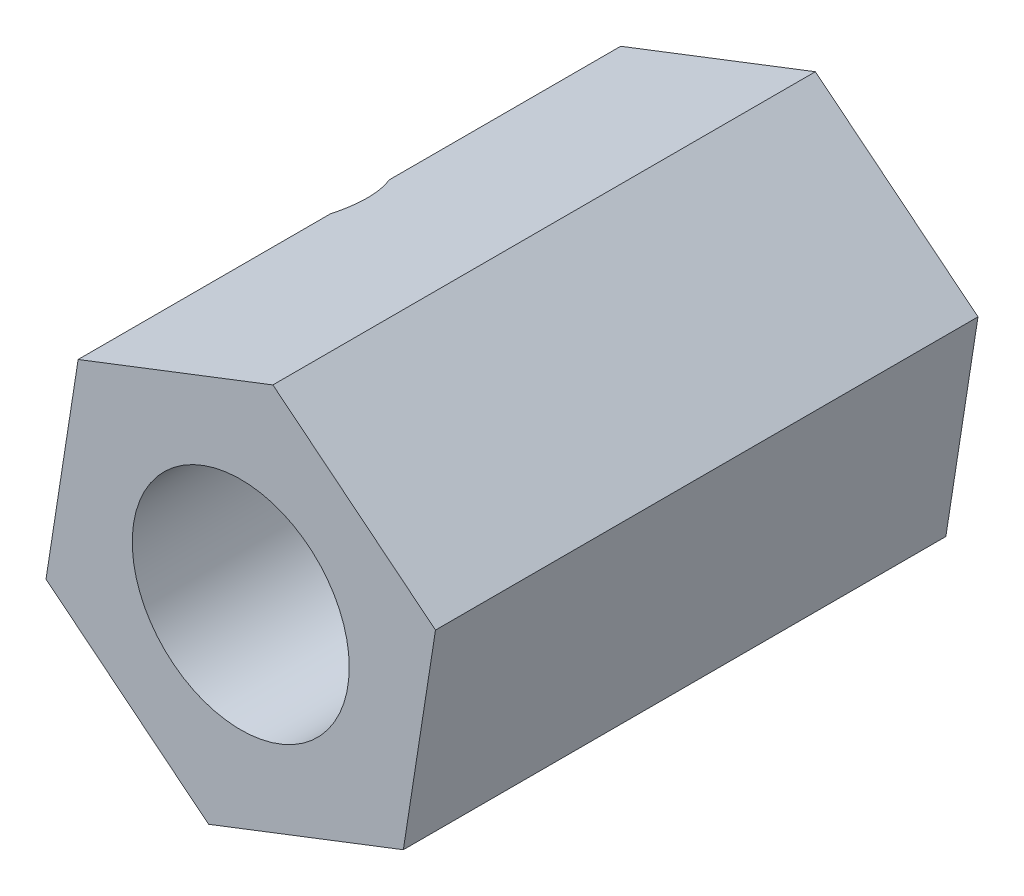
ISO-10303-21;
HEADER;
FILE_DESCRIPTION(('STEP AP214'),'2;1');
FILE_NAME('part.step','',(''),(''),'','','');
FILE_SCHEMA(('AUTOMOTIVE_DESIGN { 1 0 10303 214 1 1 1 1 }'));
ENDSEC;
DATA;
#1=APPLICATION_CONTEXT('core data for automotive mechanical design processes');
#2=APPLICATION_PROTOCOL_DEFINITION('international standard','automotive_design',2000,#1);
#3=PRODUCT_CONTEXT('',#1,'mechanical');
#4=PRODUCT('Part','Part','',(#3));
#5=PRODUCT_RELATED_PRODUCT_CATEGORY('part','',(#4));
#6=PRODUCT_DEFINITION_FORMATION('','',#4);
#7=PRODUCT_DEFINITION_CONTEXT('part definition',#1,'design');
#8=PRODUCT_DEFINITION('design','',#6,#7);
#9=PRODUCT_DEFINITION_SHAPE('','',#8);
#10=(LENGTH_UNIT() NAMED_UNIT(*) SI_UNIT(.MILLI.,.METRE.));
#11=(NAMED_UNIT(*) PLANE_ANGLE_UNIT() SI_UNIT($,.RADIAN.));
#12=(NAMED_UNIT(*) SI_UNIT($,.STERADIAN.) SOLID_ANGLE_UNIT());
#13=UNCERTAINTY_MEASURE_WITH_UNIT(LENGTH_MEASURE(1.E-05),#10,'distance_accuracy_value','');
#14=(GEOMETRIC_REPRESENTATION_CONTEXT(3) GLOBAL_UNCERTAINTY_ASSIGNED_CONTEXT((#13)) GLOBAL_UNIT_ASSIGNED_CONTEXT((#10,
#11,#12)) REPRESENTATION_CONTEXT('',''));
#15=CARTESIAN_POINT('',(0.,0.,0.));
#16=DIRECTION('',(0.,0.,1.));
#17=DIRECTION('',(1.,0.,0.));
#18=AXIS2_PLACEMENT_3D('',#15,#16,#17);
#19=CARTESIAN_POINT('',(-8.9922755808342,7.24377755122743,30.));
#20=DIRECTION('',(0.988085437498884,-0.153906361800413,0.));
#21=DIRECTION('',(0.153906361800413,0.988085437498884,0.));
#22=AXIS2_PLACEMENT_3D('',#19,#20,#21);
#23=PLANE('',#22);
#24=DIRECTION('',(0.,0.,-1.));
#25=VECTOR('',#24,1.);
#26=CARTESIAN_POINT('',(-8.9922755808342,7.24377755122743,30.));
#27=LINE('',#26,#25);
#28=CARTESIAN_POINT('',(-8.9922755808342,7.24377755122743,30.));
#29=VERTEX_POINT('',#28);
#30=CARTESIAN_POINT('',(-8.9922755808342,7.24377755122743,16.0581627388848));
#31=VERTEX_POINT('',#30);
#32=EDGE_CURVE('E121',#29,#31,#27,.T.);
#33=ORIENTED_EDGE('',*,*,#32,.T.);
#34=CARTESIAN_POINT('',(-9.88085437498884,1.53906361800413,14.4251695770294));
#35=DIRECTION('',(-0.988085437498884,0.153906361800413,0.));
#36=DIRECTION('',(-0.153906361800413,-0.988085437498884,0.));
#37=AXIS2_PLACEMENT_3D('',#34,#35,#36);
#38=CIRCLE('',#37,6.);
#39=CARTESIAN_POINT('',(-10.7694331691435,-4.16565031521917,16.0581627388848));
#40=VERTEX_POINT('',#39);
#41=EDGE_CURVE('E195',#40,#31,#38,.T.);
#42=ORIENTED_EDGE('',*,*,#41,.F.);
#43=DIRECTION('',(0.,0.,-1.));
#44=VECTOR('',#43,1.);
#45=CARTESIAN_POINT('',(-10.7694331691435,-4.16565031521917,30.));
#46=LINE('',#45,#44);
#47=CARTESIAN_POINT('',(-10.7694331691435,-4.16565031521917,30.));
#48=VERTEX_POINT('',#47);
#49=EDGE_CURVE('E133',#48,#40,#46,.T.);
#50=ORIENTED_EDGE('',*,*,#49,.F.);
#51=DIRECTION('',(-0.153906361800413,-0.988085437498884,0.));
#52=VECTOR('',#51,1.);
#53=CARTESIAN_POINT('',(-8.9922755808342,7.24377755122743,30.));
#54=LINE('',#53,#52);
#55=EDGE_CURVE('E110',#29,#48,#54,.T.);
#56=ORIENTED_EDGE('',*,*,#55,.F.);
#57=EDGE_LOOP('',(#33,#42,#50,#56));
#58=FACE_BOUND('',#57,.T.);
#59=ADVANCED_FACE('F38',(#58),#23,.F.);
#60=CARTESIAN_POINT('',(-1.77715758830929,-11.4094278664466,30.));
#61=DIRECTION('',(-0.360755899626246,0.932660270883701,0.));
#62=DIRECTION('',(-0.932660270883701,-0.360755899626246,0.));
#63=AXIS2_PLACEMENT_3D('',#60,#61,#62);
#64=PLANE('',#63);
#65=DIRECTION('',(0.932660270883701,0.360755899626246,0.));
#66=VECTOR('',#65,1.);
#67=CARTESIAN_POINT('',(-1.77715758830929,-11.4094278664466,0.));
#68=LINE('',#67,#66);
#69=CARTESIAN_POINT('',(-1.77715758830929,-11.4094278664466,0.));
#70=VERTEX_POINT('',#69);
#71=CARTESIAN_POINT('',(8.9922755808342,-7.24377755122742,0.));
#72=VERTEX_POINT('',#71);
#73=EDGE_CURVE('E141',#70,#72,#68,.T.);
#74=ORIENTED_EDGE('',*,*,#73,.T.);
#75=DIRECTION('',(0.,0.,-1.));
#76=VECTOR('',#75,1.);
#77=CARTESIAN_POINT('',(8.9922755808342,-7.24377755122742,30.));
#78=LINE('',#77,#76);
#79=CARTESIAN_POINT('',(8.9922755808342,-7.24377755122742,30.));
#80=VERTEX_POINT('',#79);
#81=EDGE_CURVE('E47',#80,#72,#78,.T.);
#82=ORIENTED_EDGE('',*,*,#81,.F.);
#83=DIRECTION('',(0.932660270883701,0.360755899626246,0.));
#84=VECTOR('',#83,1.);
#85=CARTESIAN_POINT('',(-1.77715758830929,-11.4094278664466,30.));
#86=LINE('',#85,#84);
#87=CARTESIAN_POINT('',(-1.77715758830929,-11.4094278664466,30.));
#88=VERTEX_POINT('',#87);
#89=EDGE_CURVE('E162',#88,#80,#86,.T.);
#90=ORIENTED_EDGE('',*,*,#89,.F.);
#91=DIRECTION('',(0.,0.,-1.));
#92=VECTOR('',#91,1.);
#93=CARTESIAN_POINT('',(-1.77715758830929,-11.4094278664466,30.));
#94=LINE('',#93,#92);
#95=EDGE_CURVE('E137',#88,#70,#94,.T.);
#96=ORIENTED_EDGE('',*,*,#95,.T.);
#97=EDGE_LOOP('',(#74,#82,#90,#96));
#98=FACE_BOUND('',#97,.T.);
#99=ADVANCED_FACE('F40',(#98),#64,.F.);
#100=CARTESIAN_POINT('',(8.9922755808342,-7.24377755122742,30.));
#101=DIRECTION('',(-0.988085437498884,0.153906361800412,0.));
#102=DIRECTION('',(-0.153906361800412,-0.988085437498884,0.));
#103=AXIS2_PLACEMENT_3D('',#100,#101,#102);
#104=PLANE('',#103);
#105=DIRECTION('',(0.153906361800412,0.988085437498884,0.));
#106=VECTOR('',#105,1.);
#107=CARTESIAN_POINT('',(8.9922755808342,-7.24377755122742,0.));
#108=LINE('',#107,#106);
#109=CARTESIAN_POINT('',(10.7694331691435,4.16565031521917,0.));
#110=VERTEX_POINT('',#109);
#111=EDGE_CURVE('E145',#72,#110,#108,.T.);
#112=ORIENTED_EDGE('',*,*,#111,.T.);
#113=DIRECTION('',(0.,0.,-1.));
#114=VECTOR('',#113,1.);
#115=CARTESIAN_POINT('',(10.7694331691435,4.16565031521917,30.));
#116=LINE('',#115,#114);
#117=CARTESIAN_POINT('',(10.7694331691435,4.16565031521917,30.));
#118=VERTEX_POINT('',#117);
#119=EDGE_CURVE('E170',#118,#110,#116,.T.);
#120=ORIENTED_EDGE('',*,*,#119,.F.);
#121=DIRECTION('',(0.153906361800412,0.988085437498884,0.));
#122=VECTOR('',#121,1.);
#123=CARTESIAN_POINT('',(8.9922755808342,-7.24377755122742,30.));
#124=LINE('',#123,#122);
#125=EDGE_CURVE('E97',#80,#118,#124,.T.);
#126=ORIENTED_EDGE('',*,*,#125,.F.);
#127=ORIENTED_EDGE('',*,*,#81,.T.);
#128=EDGE_LOOP('',(#112,#120,#126,#127));
#129=FACE_BOUND('',#128,.T.);
#130=ADVANCED_FACE('F175',(#129),#104,.F.);
#131=CARTESIAN_POINT('',(10.7694331691435,4.16565031521917,30.));
#132=DIRECTION('',(-0.627329537872638,-0.778753909083288,0.));
#133=DIRECTION('',(0.778753909083288,-0.627329537872638,0.));
#134=AXIS2_PLACEMENT_3D('',#131,#132,#133);
#135=PLANE('',#134);
#136=DIRECTION('',(-0.778753909083288,0.627329537872638,0.));
#137=VECTOR('',#136,1.);
#138=CARTESIAN_POINT('',(10.7694331691435,4.16565031521917,0.));
#139=LINE('',#138,#137);
#140=CARTESIAN_POINT('',(1.77715758830929,11.4094278664466,0.));
#141=VERTEX_POINT('',#140);
#142=EDGE_CURVE('E149',#110,#141,#139,.T.);
#143=ORIENTED_EDGE('',*,*,#142,.T.);
#144=DIRECTION('',(0.,0.,-1.));
#145=VECTOR('',#144,1.);
#146=CARTESIAN_POINT('',(1.77715758830929,11.4094278664466,30.));
#147=LINE('',#146,#145);
#148=CARTESIAN_POINT('',(1.77715758830929,11.4094278664466,30.));
#149=VERTEX_POINT('',#148);
#150=EDGE_CURVE('E129',#149,#141,#147,.T.);
#151=ORIENTED_EDGE('',*,*,#150,.F.);
#152=DIRECTION('',(-0.778753909083288,0.627329537872638,0.));
#153=VECTOR('',#152,1.);
#154=CARTESIAN_POINT('',(10.7694331691435,4.16565031521917,30.));
#155=LINE('',#154,#153);
#156=EDGE_CURVE('E113',#118,#149,#155,.T.);
#157=ORIENTED_EDGE('',*,*,#156,.F.);
#158=ORIENTED_EDGE('',*,*,#119,.T.);
#159=EDGE_LOOP('',(#143,#151,#157,#158));
#160=FACE_BOUND('',#159,.T.);
#161=ADVANCED_FACE('F185',(#160),#135,.F.);
#162=CARTESIAN_POINT('',(1.77715758830929,11.4094278664466,30.));
#163=DIRECTION('',(0.360755899626245,-0.932660270883701,0.));
#164=DIRECTION('',(0.932660270883701,0.360755899626245,0.));
#165=AXIS2_PLACEMENT_3D('',#162,#163,#164);
#166=PLANE('',#165);
#167=CARTESIAN_POINT('',(-8.9922755808342,7.24377755122743,12.7921764151739));
#168=VERTEX_POINT('',#167);
#169=CARTESIAN_POINT('',(-8.9922755808342,7.24377755122743,0.));
#170=VERTEX_POINT('',#169);
#171=EDGE_CURVE('E130',#168,#170,#27,.T.);
#172=ORIENTED_EDGE('',*,*,#171,.F.);
#173=CARTESIAN_POINT('',(-19.7617087499777,3.07812723600826,14.4251695770294));
#174=DIRECTION('',(0.360755899626245,-0.932660270883701,0.));
#175=DIRECTION('',(-0.932660270883701,-0.360755899626245,0.));
#176=AXIS2_PLACEMENT_3D('',#173,#174,#175);
#177=ELLIPSE('',#176,12.,6.);
#178=EDGE_CURVE('E125',#168,#31,#177,.T.);
#179=ORIENTED_EDGE('',*,*,#178,.T.);
#180=ORIENTED_EDGE('',*,*,#32,.F.);
#181=DIRECTION('',(-0.932660270883701,-0.360755899626245,0.));
#182=VECTOR('',#181,1.);
#183=CARTESIAN_POINT('',(1.77715758830929,11.4094278664466,30.));
#184=LINE('',#183,#182);
#185=EDGE_CURVE('E106',#149,#29,#184,.T.);
#186=ORIENTED_EDGE('',*,*,#185,.F.);
#187=ORIENTED_EDGE('',*,*,#150,.T.);
#188=DIRECTION('',(-0.932660270883701,-0.360755899626245,0.));
#189=VECTOR('',#188,1.);
#190=CARTESIAN_POINT('',(1.77715758830929,11.4094278664466,0.));
#191=LINE('',#190,#189);
#192=EDGE_CURVE('E152',#141,#170,#191,.T.);
#193=ORIENTED_EDGE('',*,*,#192,.T.);
#194=EDGE_LOOP('',(#172,#179,#180,#186,#187,#193));
#195=FACE_BOUND('',#194,.T.);
#196=ADVANCED_FACE('F123',(#195),#166,.F.);
#197=CARTESIAN_POINT('',(-10.7694331691435,-4.16565031521917,12.7921764151739));
#198=VERTEX_POINT('',#197);
#199=CARTESIAN_POINT('',(-10.7694331691435,-4.16565031521917,0.));
#200=VERTEX_POINT('',#199);
#201=EDGE_CURVE('E165',#198,#200,#46,.T.);
#202=ORIENTED_EDGE('',*,*,#201,.F.);
#203=EDGE_CURVE('E54',#168,#198,#38,.T.);
#204=ORIENTED_EDGE('',*,*,#203,.F.);
#205=ORIENTED_EDGE('',*,*,#171,.T.);
#206=DIRECTION('',(-0.153906361800413,-0.988085437498884,0.));
#207=VECTOR('',#206,1.);
#208=CARTESIAN_POINT('',(-8.9922755808342,7.24377755122743,0.));
#209=LINE('',#208,#207);
#210=EDGE_CURVE('E156',#170,#200,#209,.T.);
#211=ORIENTED_EDGE('',*,*,#210,.T.);
#212=EDGE_LOOP('',(#202,#204,#205,#211));
#213=FACE_BOUND('',#212,.T.);
#214=ADVANCED_FACE('F188',(#213),#23,.F.);
#215=CARTESIAN_POINT('',(-10.7694331691435,-4.16565031521917,30.));
#216=DIRECTION('',(0.627329537872638,0.778753909083288,0.));
#217=DIRECTION('',(-0.778753909083288,0.627329537872638,0.));
#218=AXIS2_PLACEMENT_3D('',#215,#216,#217);
#219=PLANE('',#218);
#220=ORIENTED_EDGE('',*,*,#49,.T.);
#221=CARTESIAN_POINT('',(-19.7617087499777,3.07812723600825,14.4251695770294));
#222=DIRECTION('',(0.627329537872638,0.778753909083288,0.));
#223=DIRECTION('',(-0.778753909083288,0.627329537872638,0.));
#224=AXIS2_PLACEMENT_3D('',#221,#222,#223);
#225=ELLIPSE('',#224,12.,6.);
#226=EDGE_CURVE('E11',#40,#198,#225,.T.);
#227=ORIENTED_EDGE('',*,*,#226,.T.);
#228=ORIENTED_EDGE('',*,*,#201,.T.);
#229=DIRECTION('',(0.778753909083288,-0.627329537872638,0.));
#230=VECTOR('',#229,1.);
#231=CARTESIAN_POINT('',(-10.7694331691435,-4.16565031521917,0.));
#232=LINE('',#231,#230);
#233=EDGE_CURVE('E88',#200,#70,#232,.T.);
#234=ORIENTED_EDGE('',*,*,#233,.T.);
#235=ORIENTED_EDGE('',*,*,#95,.F.);
#236=DIRECTION('',(0.778753909083288,-0.627329537872638,0.));
#237=VECTOR('',#236,1.);
#238=CARTESIAN_POINT('',(-10.7694331691435,-4.16565031521917,30.));
#239=LINE('',#238,#237);
#240=EDGE_CURVE('E62',#48,#88,#239,.T.);
#241=ORIENTED_EDGE('',*,*,#240,.F.);
#242=EDGE_LOOP('',(#220,#227,#228,#234,#235,#241));
#243=FACE_BOUND('',#242,.T.);
#244=ADVANCED_FACE('F191',(#243),#219,.F.);
#245=CARTESIAN_POINT('',(0.,0.,30.));
#246=DIRECTION('',(0.,0.,1.));
#247=DIRECTION('',(1.,0.,0.));
#248=AXIS2_PLACEMENT_3D('',#245,#246,#247);
#249=PLANE('',#248);
#250=CARTESIAN_POINT('',(0.,0.,30.));
#251=DIRECTION('',(0.,0.,1.));
#252=DIRECTION('',(1.,0.,0.));
#253=AXIS2_PLACEMENT_3D('',#250,#251,#252);
#254=CIRCLE('',#253,6.);
#255=CARTESIAN_POINT('',(6.,0.,30.));
#256=VERTEX_POINT('',#255);
#257=EDGE_CURVE('E207',#256,#256,#254,.T.);
#258=ORIENTED_EDGE('',*,*,#257,.F.);
#259=EDGE_LOOP('',(#258));
#260=FACE_BOUND('',#259,.T.);
#261=ORIENTED_EDGE('',*,*,#89,.T.);
#262=ORIENTED_EDGE('',*,*,#125,.T.);
#263=ORIENTED_EDGE('',*,*,#156,.T.);
#264=ORIENTED_EDGE('',*,*,#185,.T.);
#265=ORIENTED_EDGE('',*,*,#55,.T.);
#266=ORIENTED_EDGE('',*,*,#240,.T.);
#267=EDGE_LOOP('',(#261,#262,#263,#264,#265,#266));
#268=FACE_BOUND('',#267,.T.);
#269=ADVANCED_FACE('F108',(#260,#268),#249,.T.);
#270=CARTESIAN_POINT('',(0.,0.,0.));
#271=DIRECTION('',(0.,0.,1.));
#272=DIRECTION('',(1.,0.,0.));
#273=AXIS2_PLACEMENT_3D('',#270,#271,#272);
#274=PLANE('',#273);
#275=CARTESIAN_POINT('',(0.,0.,0.));
#276=DIRECTION('',(0.,0.,1.));
#277=DIRECTION('',(1.,0.,0.));
#278=AXIS2_PLACEMENT_3D('',#275,#276,#277);
#279=CIRCLE('',#278,6.);
#280=CARTESIAN_POINT('',(6.,0.,0.));
#281=VERTEX_POINT('',#280);
#282=EDGE_CURVE('E146',#281,#281,#279,.T.);
#283=ORIENTED_EDGE('',*,*,#282,.T.);
#284=EDGE_LOOP('',(#283));
#285=FACE_BOUND('',#284,.T.);
#286=ORIENTED_EDGE('',*,*,#73,.F.);
#287=ORIENTED_EDGE('',*,*,#233,.F.);
#288=ORIENTED_EDGE('',*,*,#210,.F.);
#289=ORIENTED_EDGE('',*,*,#192,.F.);
#290=ORIENTED_EDGE('',*,*,#142,.F.);
#291=ORIENTED_EDGE('',*,*,#111,.F.);
#292=EDGE_LOOP('',(#286,#287,#288,#289,#290,#291));
#293=FACE_BOUND('',#292,.T.);
#294=ADVANCED_FACE('F180',(#285,#293),#274,.F.);
#295=CARTESIAN_POINT('',(0.,0.,0.));
#296=DIRECTION('',(0.,0.,1.));
#297=DIRECTION('',(1.,0.,0.));
#298=AXIS2_PLACEMENT_3D('',#295,#296,#297);
#299=CYLINDRICAL_SURFACE('',#298,6.);
#300=ORIENTED_EDGE('',*,*,#282,.F.);
#301=EDGE_LOOP('',(#300));
#302=FACE_BOUND('',#301,.T.);
#303=ORIENTED_EDGE('',*,*,#257,.T.);
#304=EDGE_LOOP('',(#303));
#305=FACE_BOUND('',#304,.T.);
#306=ADVANCED_FACE('F220',(#302,#305),#299,.F.);
#307=CARTESIAN_POINT('',(-6.91659806249219,1.07734453260289,14.4251695770294));
#308=DIRECTION('',(-0.988085437498884,0.153906361800413,0.));
#309=DIRECTION('',(-0.153906361800413,-0.988085437498884,0.));
#310=AXIS2_PLACEMENT_3D('',#307,#308,#309);
#311=CYLINDRICAL_SURFACE('',#310,6.);
#312=CARTESIAN_POINT('',(-6.91659806249219,1.07734453260289,14.4251695770294));
#313=DIRECTION('',(-0.988085437498884,0.153906361800413,0.));
#314=DIRECTION('',(-0.153906361800413,-0.988085437498884,0.));
#315=AXIS2_PLACEMENT_3D('',#312,#313,#314);
#316=CIRCLE('',#315,6.);
#317=CARTESIAN_POINT('',(-7.84003623329467,-4.85116809239041,14.4251695770294));
#318=VERTEX_POINT('',#317);
#319=EDGE_CURVE('E198',#318,#318,#316,.T.);
#320=ORIENTED_EDGE('',*,*,#319,.F.);
#321=EDGE_LOOP('',(#320));
#322=FACE_BOUND('',#321,.T.);
#323=ORIENTED_EDGE('',*,*,#203,.T.);
#324=ORIENTED_EDGE('',*,*,#226,.F.);
#325=ORIENTED_EDGE('',*,*,#41,.T.);
#326=ORIENTED_EDGE('',*,*,#178,.F.);
#327=EDGE_LOOP('',(#323,#324,#325,#326));
#328=FACE_BOUND('',#327,.T.);
#329=ADVANCED_FACE('F194',(#322,#328),#311,.F.);
#330=CARTESIAN_POINT('',(-6.91659806249219,1.07734453260289,14.4251695770294));
#331=DIRECTION('',(-0.988085437498884,0.153906361800413,0.));
#332=DIRECTION('',(-0.153906361800413,-0.988085437498884,0.));
#333=AXIS2_PLACEMENT_3D('',#330,#331,#332);
#334=PLANE('',#333);
#335=ORIENTED_EDGE('',*,*,#319,.T.);
#336=EDGE_LOOP('',(#335));
#337=FACE_BOUND('',#336,.T.);
#338=ADVANCED_FACE('F278',(#337),#334,.T.);
#339=CLOSED_SHELL('',(#59,#99,#130,#161,#196,#214,#244,#269,#294,#306,#329,#338));
#340=MANIFOLD_SOLID_BREP('B2',#339);
#341=ADVANCED_BREP_SHAPE_REPRESENTATION('',(#18,#340),#14);
#342=SHAPE_DEFINITION_REPRESENTATION(#9,#341);
ENDSEC;
END-ISO-10303-21;
